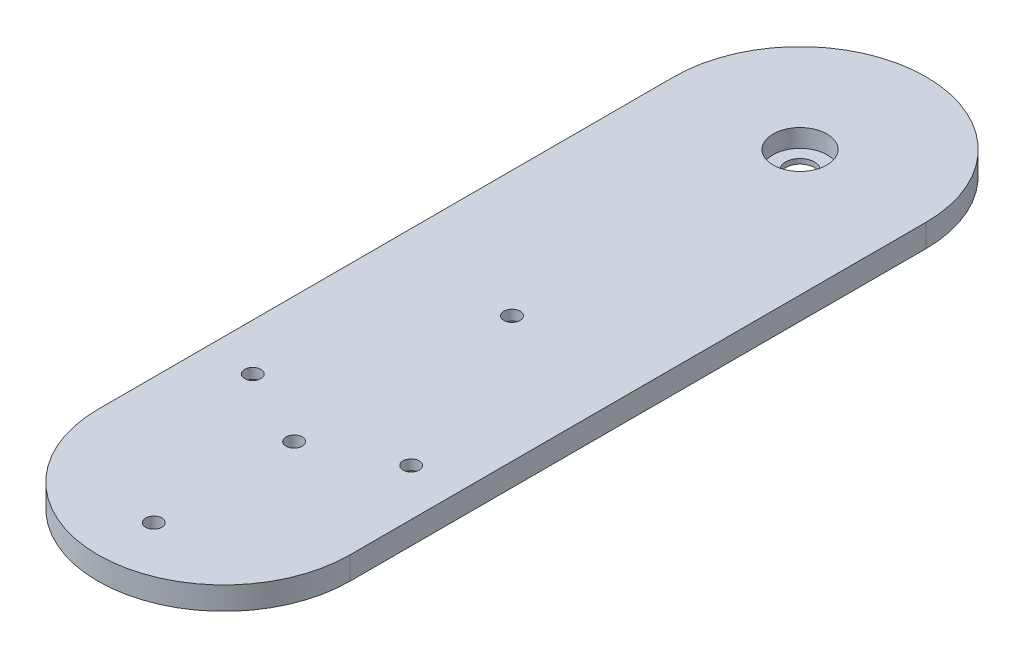
ISO-10303-21;
HEADER;
FILE_DESCRIPTION(('STEP AP214'),'2;1');
FILE_NAME('part.step','',(''),(''),'','','');
FILE_SCHEMA(('AUTOMOTIVE_DESIGN { 1 0 10303 214 1 1 1 1 }'));
ENDSEC;
DATA;
#1=APPLICATION_CONTEXT('core data for automotive mechanical design processes');
#2=APPLICATION_PROTOCOL_DEFINITION('international standard','automotive_design',2000,#1);
#3=PRODUCT_CONTEXT('',#1,'mechanical');
#4=PRODUCT('Part','Part','',(#3));
#5=PRODUCT_RELATED_PRODUCT_CATEGORY('part','',(#4));
#6=PRODUCT_DEFINITION_FORMATION('','',#4);
#7=PRODUCT_DEFINITION_CONTEXT('part definition',#1,'design');
#8=PRODUCT_DEFINITION('design','',#6,#7);
#9=PRODUCT_DEFINITION_SHAPE('','',#8);
#10=(LENGTH_UNIT() NAMED_UNIT(*) SI_UNIT(.MILLI.,.METRE.));
#11=(NAMED_UNIT(*) PLANE_ANGLE_UNIT() SI_UNIT($,.RADIAN.));
#12=(NAMED_UNIT(*) SI_UNIT($,.STERADIAN.) SOLID_ANGLE_UNIT());
#13=UNCERTAINTY_MEASURE_WITH_UNIT(LENGTH_MEASURE(1.E-05),#10,'distance_accuracy_value','');
#14=(GEOMETRIC_REPRESENTATION_CONTEXT(3) GLOBAL_UNCERTAINTY_ASSIGNED_CONTEXT((#13)) GLOBAL_UNIT_ASSIGNED_CONTEXT((#10,
#11,#12)) REPRESENTATION_CONTEXT('',''));
#15=CARTESIAN_POINT('',(0.,0.,0.));
#16=DIRECTION('',(0.,0.,1.));
#17=DIRECTION('',(1.,0.,0.));
#18=AXIS2_PLACEMENT_3D('',#15,#16,#17);
#19=CARTESIAN_POINT('',(22.,-46.75,300.));
#20=DIRECTION('',(0.,-1.,0.));
#21=DIRECTION('',(0.,0.,-1.));
#22=AXIS2_PLACEMENT_3D('',#19,#20,#21);
#23=CYLINDRICAL_SURFACE('',#22,2.25);
#24=CARTESIAN_POINT('',(22.,-46.75,300.));
#25=DIRECTION('',(0.,1.,0.));
#26=DIRECTION('',(0.,0.,1.));
#27=AXIS2_PLACEMENT_3D('',#24,#25,#26);
#28=CIRCLE('',#27,2.25);
#29=CARTESIAN_POINT('',(22.,-46.75,302.25));
#30=VERTEX_POINT('',#29);
#31=EDGE_CURVE('E150',#30,#30,#28,.T.);
#32=ORIENTED_EDGE('',*,*,#31,.T.);
#33=EDGE_LOOP('',(#32));
#34=FACE_BOUND('',#33,.T.);
#35=CARTESIAN_POINT('',(22.,-49.6,300.));
#36=DIRECTION('',(0.,-1.,0.));
#37=DIRECTION('',(0.,0.,-1.));
#38=AXIS2_PLACEMENT_3D('',#35,#36,#37);
#39=CIRCLE('',#38,2.25);
#40=CARTESIAN_POINT('',(22.,-49.6,297.75));
#41=VERTEX_POINT('',#40);
#42=EDGE_CURVE('E43',#41,#41,#39,.T.);
#43=ORIENTED_EDGE('',*,*,#42,.T.);
#44=EDGE_LOOP('',(#43));
#45=FACE_BOUND('',#44,.T.);
#46=ADVANCED_FACE('F39',(#34,#45),#23,.F.);
#47=CARTESIAN_POINT('',(-22.,-46.75,300.));
#48=DIRECTION('',(0.,-1.,0.));
#49=DIRECTION('',(0.,0.,-1.));
#50=AXIS2_PLACEMENT_3D('',#47,#48,#49);
#51=CYLINDRICAL_SURFACE('',#50,2.25);
#52=CARTESIAN_POINT('',(-22.,-46.75,300.));
#53=DIRECTION('',(0.,1.,0.));
#54=DIRECTION('',(0.,0.,1.));
#55=AXIS2_PLACEMENT_3D('',#52,#53,#54);
#56=CIRCLE('',#55,2.25);
#57=CARTESIAN_POINT('',(-22.,-46.75,302.25));
#58=VERTEX_POINT('',#57);
#59=EDGE_CURVE('E152',#58,#58,#56,.T.);
#60=ORIENTED_EDGE('',*,*,#59,.T.);
#61=EDGE_LOOP('',(#60));
#62=FACE_BOUND('',#61,.T.);
#63=CARTESIAN_POINT('',(-22.,-49.6,300.));
#64=DIRECTION('',(0.,-1.,0.));
#65=DIRECTION('',(0.,0.,-1.));
#66=AXIS2_PLACEMENT_3D('',#63,#64,#65);
#67=CIRCLE('',#66,2.25);
#68=CARTESIAN_POINT('',(-22.,-49.6,297.75));
#69=VERTEX_POINT('',#68);
#70=EDGE_CURVE('E117',#69,#69,#67,.T.);
#71=ORIENTED_EDGE('',*,*,#70,.T.);
#72=EDGE_LOOP('',(#71));
#73=FACE_BOUND('',#72,.T.);
#74=ADVANCED_FACE('F172',(#62,#73),#51,.F.);
#75=CARTESIAN_POINT('',(0.,-46.75,250.));
#76=DIRECTION('',(0.,-1.,0.));
#77=DIRECTION('',(0.,0.,-1.));
#78=AXIS2_PLACEMENT_3D('',#75,#76,#77);
#79=CYLINDRICAL_SURFACE('',#78,2.25);
#80=CARTESIAN_POINT('',(0.,-46.75,250.));
#81=DIRECTION('',(0.,1.,0.));
#82=DIRECTION('',(0.,0.,1.));
#83=AXIS2_PLACEMENT_3D('',#80,#81,#82);
#84=CIRCLE('',#83,2.25);
#85=CARTESIAN_POINT('',(0.,-46.75,252.25));
#86=VERTEX_POINT('',#85);
#87=EDGE_CURVE('E106',#86,#86,#84,.T.);
#88=ORIENTED_EDGE('',*,*,#87,.T.);
#89=EDGE_LOOP('',(#88));
#90=FACE_BOUND('',#89,.T.);
#91=CARTESIAN_POINT('',(0.,-49.6,250.));
#92=DIRECTION('',(0.,-1.,0.));
#93=DIRECTION('',(0.,0.,-1.));
#94=AXIS2_PLACEMENT_3D('',#91,#92,#93);
#95=CIRCLE('',#94,2.25);
#96=CARTESIAN_POINT('',(0.,-49.6,247.75));
#97=VERTEX_POINT('',#96);
#98=EDGE_CURVE('E116',#97,#97,#95,.T.);
#99=ORIENTED_EDGE('',*,*,#98,.T.);
#100=EDGE_LOOP('',(#99));
#101=FACE_BOUND('',#100,.T.);
#102=ADVANCED_FACE('F179',(#90,#101),#79,.F.);
#103=CARTESIAN_POINT('',(35.,-46.75,330.));
#104=DIRECTION('',(-1.,0.,0.));
#105=DIRECTION('',(0.,0.,1.));
#106=AXIS2_PLACEMENT_3D('',#103,#104,#105);
#107=PLANE('',#106);
#108=DIRECTION('',(0.,0.,-1.));
#109=VECTOR('',#108,1.);
#110=CARTESIAN_POINT('',(35.,-53.1,330.));
#111=LINE('',#110,#109);
#112=CARTESIAN_POINT('',(35.,-53.1,330.));
#113=VERTEX_POINT('',#112);
#114=CARTESIAN_POINT('',(35.,-53.1,170.));
#115=VERTEX_POINT('',#114);
#116=EDGE_CURVE('E89',#113,#115,#111,.T.);
#117=ORIENTED_EDGE('',*,*,#116,.T.);
#118=DIRECTION('',(0.,-1.,0.));
#119=VECTOR('',#118,1.);
#120=CARTESIAN_POINT('',(35.,-46.75,170.));
#121=LINE('',#120,#119);
#122=CARTESIAN_POINT('',(35.,-46.75,170.));
#123=VERTEX_POINT('',#122);
#124=EDGE_CURVE('E11',#123,#115,#121,.T.);
#125=ORIENTED_EDGE('',*,*,#124,.F.);
#126=DIRECTION('',(0.,0.,-1.));
#127=VECTOR('',#126,1.);
#128=CARTESIAN_POINT('',(35.,-46.75,330.));
#129=LINE('',#128,#127);
#130=CARTESIAN_POINT('',(35.,-46.75,330.));
#131=VERTEX_POINT('',#130);
#132=EDGE_CURVE('E59',#131,#123,#129,.T.);
#133=ORIENTED_EDGE('',*,*,#132,.F.);
#134=DIRECTION('',(0.,-1.,0.));
#135=VECTOR('',#134,1.);
#136=CARTESIAN_POINT('',(35.,-46.75,330.));
#137=LINE('',#136,#135);
#138=EDGE_CURVE('E96',#131,#113,#137,.T.);
#139=ORIENTED_EDGE('',*,*,#138,.T.);
#140=EDGE_LOOP('',(#117,#125,#133,#139));
#141=FACE_BOUND('',#140,.T.);
#142=ADVANCED_FACE('F41',(#141),#107,.F.);
#143=CARTESIAN_POINT('',(-35.,-46.75,330.));
#144=DIRECTION('',(1.,0.,0.));
#145=DIRECTION('',(0.,0.,-1.));
#146=AXIS2_PLACEMENT_3D('',#143,#144,#145);
#147=PLANE('',#146);
#148=DIRECTION('',(0.,0.,1.));
#149=VECTOR('',#148,1.);
#150=CARTESIAN_POINT('',(-35.,-53.1,330.));
#151=LINE('',#150,#149);
#152=CARTESIAN_POINT('',(-35.,-53.1,170.));
#153=VERTEX_POINT('',#152);
#154=CARTESIAN_POINT('',(-35.,-53.1,330.));
#155=VERTEX_POINT('',#154);
#156=EDGE_CURVE('E81',#153,#155,#151,.T.);
#157=ORIENTED_EDGE('',*,*,#156,.T.);
#158=DIRECTION('',(0.,-1.,0.));
#159=VECTOR('',#158,1.);
#160=CARTESIAN_POINT('',(-35.,-46.75,330.));
#161=LINE('',#160,#159);
#162=CARTESIAN_POINT('',(-35.,-46.75,330.));
#163=VERTEX_POINT('',#162);
#164=EDGE_CURVE('E86',#163,#155,#161,.T.);
#165=ORIENTED_EDGE('',*,*,#164,.F.);
#166=DIRECTION('',(0.,0.,1.));
#167=VECTOR('',#166,1.);
#168=CARTESIAN_POINT('',(-35.,-46.75,330.));
#169=LINE('',#168,#167);
#170=CARTESIAN_POINT('',(-35.,-46.75,170.));
#171=VERTEX_POINT('',#170);
#172=EDGE_CURVE('E111',#171,#163,#169,.T.);
#173=ORIENTED_EDGE('',*,*,#172,.F.);
#174=DIRECTION('',(0.,-1.,0.));
#175=VECTOR('',#174,1.);
#176=CARTESIAN_POINT('',(-35.,-46.75,170.));
#177=LINE('',#176,#175);
#178=EDGE_CURVE('E47',#171,#153,#177,.T.);
#179=ORIENTED_EDGE('',*,*,#178,.T.);
#180=EDGE_LOOP('',(#157,#165,#173,#179));
#181=FACE_BOUND('',#180,.T.);
#182=ADVANCED_FACE('F83',(#181),#147,.F.);
#183=CARTESIAN_POINT('',(0.,-46.75,0.));
#184=DIRECTION('',(0.,-1.,0.));
#185=DIRECTION('',(0.,0.,-1.));
#186=AXIS2_PLACEMENT_3D('',#183,#184,#185);
#187=PLANE('',#186);
#188=CARTESIAN_POINT('',(0.,-46.75,310.5));
#189=DIRECTION('',(0.,1.,0.));
#190=DIRECTION('',(0.,0.,1.));
#191=AXIS2_PLACEMENT_3D('',#188,#189,#190);
#192=CIRCLE('',#191,2.25);
#193=CARTESIAN_POINT('',(0.,-46.75,312.75));
#194=VERTEX_POINT('',#193);
#195=EDGE_CURVE('E144',#194,#194,#192,.T.);
#196=ORIENTED_EDGE('',*,*,#195,.F.);
#197=EDGE_LOOP('',(#196));
#198=FACE_BOUND('',#197,.T.);
#199=CARTESIAN_POINT('',(0.,-46.75,349.5));
#200=DIRECTION('',(0.,1.,0.));
#201=DIRECTION('',(0.,0.,1.));
#202=AXIS2_PLACEMENT_3D('',#199,#200,#201);
#203=CIRCLE('',#202,2.25);
#204=CARTESIAN_POINT('',(0.,-46.75,351.75));
#205=VERTEX_POINT('',#204);
#206=EDGE_CURVE('E121',#205,#205,#203,.T.);
#207=ORIENTED_EDGE('',*,*,#206,.F.);
#208=EDGE_LOOP('',(#207));
#209=FACE_BOUND('',#208,.T.);
#210=CARTESIAN_POINT('',(0.,-46.75,170.));
#211=DIRECTION('',(0.,1.,0.));
#212=DIRECTION('',(0.,0.,1.));
#213=AXIS2_PLACEMENT_3D('',#210,#211,#212);
#214=CIRCLE('',#213,7.475);
#215=CARTESIAN_POINT('',(0.,-46.75,177.475));
#216=VERTEX_POINT('',#215);
#217=EDGE_CURVE('E143',#216,#216,#214,.T.);
#218=ORIENTED_EDGE('',*,*,#217,.F.);
#219=EDGE_LOOP('',(#218));
#220=FACE_BOUND('',#219,.T.);
#221=ORIENTED_EDGE('',*,*,#87,.F.);
#222=EDGE_LOOP('',(#221));
#223=FACE_BOUND('',#222,.T.);
#224=ORIENTED_EDGE('',*,*,#59,.F.);
#225=EDGE_LOOP('',(#224));
#226=FACE_BOUND('',#225,.T.);
#227=ORIENTED_EDGE('',*,*,#31,.F.);
#228=EDGE_LOOP('',(#227));
#229=FACE_BOUND('',#228,.T.);
#230=ORIENTED_EDGE('',*,*,#132,.T.);
#231=CARTESIAN_POINT('',(0.,-46.75,170.));
#232=DIRECTION('',(0.,1.,0.));
#233=DIRECTION('',(0.,0.,1.));
#234=AXIS2_PLACEMENT_3D('',#231,#232,#233);
#235=CIRCLE('',#234,35.);
#236=EDGE_CURVE('E104',#123,#171,#235,.T.);
#237=ORIENTED_EDGE('',*,*,#236,.T.);
#238=ORIENTED_EDGE('',*,*,#172,.T.);
#239=CARTESIAN_POINT('',(0.,-46.75,330.));
#240=DIRECTION('',(0.,1.,0.));
#241=DIRECTION('',(0.,0.,1.));
#242=AXIS2_PLACEMENT_3D('',#239,#240,#241);
#243=CIRCLE('',#242,35.);
#244=EDGE_CURVE('E97',#163,#131,#243,.T.);
#245=ORIENTED_EDGE('',*,*,#244,.T.);
#246=EDGE_LOOP('',(#230,#237,#238,#245));
#247=FACE_BOUND('',#246,.T.);
#248=ADVANCED_FACE('F158',(#198,#209,#220,#223,#226,#229,#247),#187,.F.);
#249=CARTESIAN_POINT('',(0.,-53.1,0.));
#250=DIRECTION('',(0.,-1.,0.));
#251=DIRECTION('',(0.,0.,-1.));
#252=AXIS2_PLACEMENT_3D('',#249,#250,#251);
#253=PLANE('',#252);
#254=CARTESIAN_POINT('',(0.,-53.1,250.));
#255=DIRECTION('',(0.,-1.,0.));
#256=DIRECTION('',(0.,0.,-1.));
#257=AXIS2_PLACEMENT_3D('',#254,#255,#256);
#258=CIRCLE('',#257,4.);
#259=CARTESIAN_POINT('',(0.,-53.1,246.));
#260=VERTEX_POINT('',#259);
#261=EDGE_CURVE('E230',#260,#260,#258,.T.);
#262=ORIENTED_EDGE('',*,*,#261,.F.);
#263=EDGE_LOOP('',(#262));
#264=FACE_BOUND('',#263,.T.);
#265=CARTESIAN_POINT('',(22.,-53.1,300.));
#266=DIRECTION('',(0.,-1.,0.));
#267=DIRECTION('',(0.,0.,-1.));
#268=AXIS2_PLACEMENT_3D('',#265,#266,#267);
#269=CIRCLE('',#268,4.);
#270=CARTESIAN_POINT('',(22.,-53.1,296.));
#271=VERTEX_POINT('',#270);
#272=EDGE_CURVE('E235',#271,#271,#269,.T.);
#273=ORIENTED_EDGE('',*,*,#272,.F.);
#274=EDGE_LOOP('',(#273));
#275=FACE_BOUND('',#274,.T.);
#276=CARTESIAN_POINT('',(-22.,-53.1,300.));
#277=DIRECTION('',(0.,-1.,0.));
#278=DIRECTION('',(0.,0.,-1.));
#279=AXIS2_PLACEMENT_3D('',#276,#277,#278);
#280=CIRCLE('',#279,4.);
#281=CARTESIAN_POINT('',(-22.,-53.1,296.));
#282=VERTEX_POINT('',#281);
#283=EDGE_CURVE('E239',#282,#282,#280,.T.);
#284=ORIENTED_EDGE('',*,*,#283,.F.);
#285=EDGE_LOOP('',(#284));
#286=FACE_BOUND('',#285,.T.);
#287=CARTESIAN_POINT('',(0.,-53.1,310.5));
#288=DIRECTION('',(0.,1.,0.));
#289=DIRECTION('',(0.,0.,1.));
#290=AXIS2_PLACEMENT_3D('',#287,#288,#289);
#291=CIRCLE('',#290,2.25);
#292=CARTESIAN_POINT('',(0.,-53.1,312.75));
#293=VERTEX_POINT('',#292);
#294=EDGE_CURVE('E132',#293,#293,#291,.T.);
#295=ORIENTED_EDGE('',*,*,#294,.T.);
#296=EDGE_LOOP('',(#295));
#297=FACE_BOUND('',#296,.T.);
#298=CARTESIAN_POINT('',(0.,-53.1,349.5));
#299=DIRECTION('',(0.,1.,0.));
#300=DIRECTION('',(0.,0.,1.));
#301=AXIS2_PLACEMENT_3D('',#298,#299,#300);
#302=CIRCLE('',#301,2.25);
#303=CARTESIAN_POINT('',(0.,-53.1,351.75));
#304=VERTEX_POINT('',#303);
#305=EDGE_CURVE('E130',#304,#304,#302,.T.);
#306=ORIENTED_EDGE('',*,*,#305,.T.);
#307=EDGE_LOOP('',(#306));
#308=FACE_BOUND('',#307,.T.);
#309=CARTESIAN_POINT('',(0.,-53.1,170.));
#310=DIRECTION('',(0.,1.,0.));
#311=DIRECTION('',(0.,0.,1.));
#312=AXIS2_PLACEMENT_3D('',#309,#310,#311);
#313=CIRCLE('',#312,4.);
#314=CARTESIAN_POINT('',(0.,-53.1,166.));
#315=VERTEX_POINT('',#314);
#316=EDGE_CURVE('E142',#315,#315,#313,.T.);
#317=ORIENTED_EDGE('',*,*,#316,.T.);
#318=EDGE_LOOP('',(#317));
#319=FACE_BOUND('',#318,.T.);
#320=ORIENTED_EDGE('',*,*,#156,.F.);
#321=CARTESIAN_POINT('',(0.,-53.1,170.));
#322=DIRECTION('',(0.,1.,0.));
#323=DIRECTION('',(0.,0.,1.));
#324=AXIS2_PLACEMENT_3D('',#321,#322,#323);
#325=CIRCLE('',#324,35.);
#326=EDGE_CURVE('E68',#115,#153,#325,.T.);
#327=ORIENTED_EDGE('',*,*,#326,.F.);
#328=ORIENTED_EDGE('',*,*,#116,.F.);
#329=CARTESIAN_POINT('',(0.,-53.1,330.));
#330=DIRECTION('',(0.,1.,0.));
#331=DIRECTION('',(0.,0.,1.));
#332=AXIS2_PLACEMENT_3D('',#329,#330,#331);
#333=CIRCLE('',#332,35.);
#334=EDGE_CURVE('E95',#155,#113,#333,.T.);
#335=ORIENTED_EDGE('',*,*,#334,.F.);
#336=EDGE_LOOP('',(#320,#327,#328,#335));
#337=FACE_BOUND('',#336,.T.);
#338=ADVANCED_FACE('F103',(#264,#275,#286,#297,#308,#319,#337),#253,.T.);
#339=CARTESIAN_POINT('',(0.,-46.75,330.));
#340=DIRECTION('',(0.,-1.,0.));
#341=DIRECTION('',(0.,0.,-1.));
#342=AXIS2_PLACEMENT_3D('',#339,#340,#341);
#343=CYLINDRICAL_SURFACE('',#342,35.);
#344=ORIENTED_EDGE('',*,*,#334,.T.);
#345=ORIENTED_EDGE('',*,*,#138,.F.);
#346=ORIENTED_EDGE('',*,*,#244,.F.);
#347=ORIENTED_EDGE('',*,*,#164,.T.);
#348=EDGE_LOOP('',(#344,#345,#346,#347));
#349=FACE_BOUND('',#348,.T.);
#350=ADVANCED_FACE('F93',(#349),#343,.T.);
#351=CARTESIAN_POINT('',(0.,-46.75,170.));
#352=DIRECTION('',(0.,-1.,0.));
#353=DIRECTION('',(0.,0.,-1.));
#354=AXIS2_PLACEMENT_3D('',#351,#352,#353);
#355=CYLINDRICAL_SURFACE('',#354,35.);
#356=ORIENTED_EDGE('',*,*,#236,.F.);
#357=ORIENTED_EDGE('',*,*,#124,.T.);
#358=ORIENTED_EDGE('',*,*,#326,.T.);
#359=ORIENTED_EDGE('',*,*,#178,.F.);
#360=EDGE_LOOP('',(#356,#357,#358,#359));
#361=FACE_BOUND('',#360,.T.);
#362=ADVANCED_FACE('F160',(#361),#355,.T.);
#363=CARTESIAN_POINT('',(0.,-46.75,170.));
#364=DIRECTION('',(0.,-1.,0.));
#365=DIRECTION('',(0.,0.,-1.));
#366=AXIS2_PLACEMENT_3D('',#363,#364,#365);
#367=CYLINDRICAL_SURFACE('',#366,7.475);
#368=ORIENTED_EDGE('',*,*,#217,.T.);
#369=EDGE_LOOP('',(#368));
#370=FACE_BOUND('',#369,.T.);
#371=CARTESIAN_POINT('',(0.,-51.75,170.));
#372=DIRECTION('',(0.,1.,0.));
#373=DIRECTION('',(0.,0.,1.));
#374=AXIS2_PLACEMENT_3D('',#371,#372,#373);
#375=CIRCLE('',#374,7.475);
#376=CARTESIAN_POINT('',(0.,-51.75,177.475));
#377=VERTEX_POINT('',#376);
#378=EDGE_CURVE('E140',#377,#377,#375,.T.);
#379=ORIENTED_EDGE('',*,*,#378,.F.);
#380=EDGE_LOOP('',(#379));
#381=FACE_BOUND('',#380,.T.);
#382=ADVANCED_FACE('F162',(#370,#381),#367,.F.);
#383=CARTESIAN_POINT('',(0.,-51.75,170.));
#384=DIRECTION('',(0.,1.,0.));
#385=DIRECTION('',(0.,0.,1.));
#386=AXIS2_PLACEMENT_3D('',#383,#384,#385);
#387=PLANE('',#386);
#388=CARTESIAN_POINT('',(0.,-51.75,170.));
#389=DIRECTION('',(0.,1.,0.));
#390=DIRECTION('',(0.,0.,1.));
#391=AXIS2_PLACEMENT_3D('',#388,#389,#390);
#392=CIRCLE('',#391,4.);
#393=CARTESIAN_POINT('',(0.,-51.75,166.));
#394=VERTEX_POINT('',#393);
#395=EDGE_CURVE('E137',#394,#394,#392,.T.);
#396=ORIENTED_EDGE('',*,*,#395,.F.);
#397=EDGE_LOOP('',(#396));
#398=FACE_BOUND('',#397,.T.);
#399=ORIENTED_EDGE('',*,*,#378,.T.);
#400=EDGE_LOOP('',(#399));
#401=FACE_BOUND('',#400,.T.);
#402=ADVANCED_FACE('F166',(#398,#401),#387,.T.);
#403=CARTESIAN_POINT('',(0.,-51.75,170.));
#404=DIRECTION('',(0.,-1.,0.));
#405=DIRECTION('',(0.,0.,-1.));
#406=AXIS2_PLACEMENT_3D('',#403,#404,#405);
#407=CYLINDRICAL_SURFACE('',#406,4.);
#408=CARTESIAN_POINT('',(0.,-51.75,166.));
#409=CARTESIAN_POINT('',(0.,-51.7640625,166.));
#410=CARTESIAN_POINT('',(0.,-51.778125,166.));
#411=CARTESIAN_POINT('',(0.,-51.80625,166.));
#412=CARTESIAN_POINT('',(0.,-51.8203125,166.));
#413=CARTESIAN_POINT('',(0.,-51.8484375,166.));
#414=CARTESIAN_POINT('',(0.,-51.8625,166.));
#415=CARTESIAN_POINT('',(0.,-51.890625,166.));
#416=CARTESIAN_POINT('',(0.,-51.9046875,166.));
#417=CARTESIAN_POINT('',(0.,-51.9328125,166.));
#418=CARTESIAN_POINT('',(0.,-51.946875,166.));
#419=CARTESIAN_POINT('',(0.,-51.975,166.));
#420=CARTESIAN_POINT('',(0.,-51.9890625,166.));
#421=CARTESIAN_POINT('',(0.,-52.0171875,166.));
#422=CARTESIAN_POINT('',(0.,-52.03125,166.));
#423=CARTESIAN_POINT('',(0.,-52.059375,166.));
#424=CARTESIAN_POINT('',(0.,-52.0734375,166.));
#425=CARTESIAN_POINT('',(0.,-52.1015625,166.));
#426=CARTESIAN_POINT('',(0.,-52.115625,166.));
#427=CARTESIAN_POINT('',(0.,-52.14375,166.));
#428=CARTESIAN_POINT('',(0.,-52.1578125,166.));
#429=CARTESIAN_POINT('',(0.,-52.1859375,166.));
#430=CARTESIAN_POINT('',(0.,-52.2,166.));
#431=CARTESIAN_POINT('',(0.,-52.228125,166.));
#432=CARTESIAN_POINT('',(0.,-52.2421875,166.));
#433=CARTESIAN_POINT('',(0.,-52.2703125,166.));
#434=CARTESIAN_POINT('',(0.,-52.284375,166.));
#435=CARTESIAN_POINT('',(0.,-52.3125,166.));
#436=CARTESIAN_POINT('',(0.,-52.3265625,166.));
#437=CARTESIAN_POINT('',(0.,-52.3546875,166.));
#438=CARTESIAN_POINT('',(0.,-52.36875,166.));
#439=CARTESIAN_POINT('',(0.,-52.396875,166.));
#440=CARTESIAN_POINT('',(0.,-52.4109375,166.));
#441=CARTESIAN_POINT('',(0.,-52.4390625,166.));
#442=CARTESIAN_POINT('',(0.,-52.453125,166.));
#443=CARTESIAN_POINT('',(0.,-52.48125,166.));
#444=CARTESIAN_POINT('',(0.,-52.4953125,166.));
#445=CARTESIAN_POINT('',(0.,-52.5234375,166.));
#446=CARTESIAN_POINT('',(0.,-52.5375,166.));
#447=CARTESIAN_POINT('',(0.,-52.565625,166.));
#448=CARTESIAN_POINT('',(0.,-52.5796875,166.));
#449=CARTESIAN_POINT('',(0.,-52.6078125,166.));
#450=CARTESIAN_POINT('',(0.,-52.621875,166.));
#451=CARTESIAN_POINT('',(0.,-52.65,166.));
#452=CARTESIAN_POINT('',(0.,-52.6640625,166.));
#453=CARTESIAN_POINT('',(0.,-52.6921875,166.));
#454=CARTESIAN_POINT('',(0.,-52.70625,166.));
#455=CARTESIAN_POINT('',(0.,-52.734375,166.));
#456=CARTESIAN_POINT('',(0.,-52.7484375,166.));
#457=CARTESIAN_POINT('',(0.,-52.7765625,166.));
#458=CARTESIAN_POINT('',(0.,-52.790625,166.));
#459=CARTESIAN_POINT('',(0.,-52.81875,166.));
#460=CARTESIAN_POINT('',(0.,-52.8328125,166.));
#461=CARTESIAN_POINT('',(0.,-52.8609375,166.));
#462=CARTESIAN_POINT('',(0.,-52.875,166.));
#463=CARTESIAN_POINT('',(0.,-52.903125,166.));
#464=CARTESIAN_POINT('',(0.,-52.9171875,166.));
#465=CARTESIAN_POINT('',(0.,-52.9453125,166.));
#466=CARTESIAN_POINT('',(0.,-52.959375,166.));
#467=CARTESIAN_POINT('',(0.,-52.9875,166.));
#468=CARTESIAN_POINT('',(0.,-53.0015625,166.));
#469=CARTESIAN_POINT('',(0.,-53.0296875,166.));
#470=CARTESIAN_POINT('',(0.,-53.04375,166.));
#471=CARTESIAN_POINT('',(0.,-53.071875,166.));
#472=CARTESIAN_POINT('',(0.,-53.0859375,166.));
#473=CARTESIAN_POINT('',(0.,-53.1,166.));
#474=B_SPLINE_CURVE_WITH_KNOTS('',3,(#408,#409,#410,#411,#412,#413,#414,#415,#416,#417,#418,
#419,#420,#421,#422,#423,#424,#425,#426,#427,#428,#429,#430,#431,#432,#433,#434,#435,#436,#437,
#438,#439,#440,#441,#442,#443,#444,#445,#446,#447,#448,#449,#450,#451,#452,#453,#454,#455,#456,
#457,#458,#459,#460,#461,#462,#463,#464,#465,#466,#467,#468,#469,#470,#471,#472,#473),
.UNSPECIFIED.,.F.,.F.,(4,2,2,2,2,2,2,2,2,2,2,2,2,2,2,2,2,2,2,2,2,2,2,2,2,2,2,2,2,2,2,2,4),(0.,
0.0421874999999988,0.0843749999999976,0.126562499999996,0.168749999999995,0.210937499999994,
0.253124999999993,0.295312499999999,0.337499999999998,0.379687499999996,0.421874999999995,
0.464062499999994,0.506249999999993,0.548437499999999,0.590624999999997,0.632812499999996,
0.674999999999995,0.717187499999994,0.759374999999993,0.801562499999992,0.843749999999997,
0.885937499999996,0.928124999999995,0.970312499999994,1.01249999999999,1.05468749999999,
1.096875,1.1390625,1.18124999999999,1.22343749999999,1.26562499999999,1.30781249999999,
1.34999999999999),.UNSPECIFIED.);
#475=EDGE_CURVE('BSEAM186',#394,#315,#474,.T.);
#476=ORIENTED_EDGE('',*,*,#395,.T.);
#477=ORIENTED_EDGE('',*,*,#316,.F.);
#478=ORIENTED_EDGE('',*,*,#475,.T.);
#479=ORIENTED_EDGE('',*,*,#475,.F.);
#480=EDGE_LOOP('',(#476,#478,#477,#479));
#481=FACE_BOUND('',#480,.T.);
#482=ADVANCED_FACE('F186',(#481),#407,.F.);
#483=CARTESIAN_POINT('',(0.,-46.75,349.5));
#484=DIRECTION('',(0.,-1.,0.));
#485=DIRECTION('',(0.,0.,-1.));
#486=AXIS2_PLACEMENT_3D('',#483,#484,#485);
#487=CYLINDRICAL_SURFACE('',#486,2.25);
#488=ORIENTED_EDGE('',*,*,#206,.T.);
#489=EDGE_LOOP('',(#488));
#490=FACE_BOUND('',#489,.T.);
#491=ORIENTED_EDGE('',*,*,#305,.F.);
#492=EDGE_LOOP('',(#491));
#493=FACE_BOUND('',#492,.T.);
#494=ADVANCED_FACE('F195',(#490,#493),#487,.F.);
#495=CARTESIAN_POINT('',(0.,-46.75,310.5));
#496=DIRECTION('',(0.,-1.,0.));
#497=DIRECTION('',(0.,0.,-1.));
#498=AXIS2_PLACEMENT_3D('',#495,#496,#497);
#499=CYLINDRICAL_SURFACE('',#498,2.25);
#500=ORIENTED_EDGE('',*,*,#195,.T.);
#501=EDGE_LOOP('',(#500));
#502=FACE_BOUND('',#501,.T.);
#503=ORIENTED_EDGE('',*,*,#294,.F.);
#504=EDGE_LOOP('',(#503));
#505=FACE_BOUND('',#504,.T.);
#506=ADVANCED_FACE('F200',(#502,#505),#499,.F.);
#507=CARTESIAN_POINT('',(0.,-49.6,250.));
#508=DIRECTION('',(0.,-1.,0.));
#509=DIRECTION('',(0.,0.,-1.));
#510=AXIS2_PLACEMENT_3D('',#507,#508,#509);
#511=CYLINDRICAL_SURFACE('',#510,4.);
#512=CARTESIAN_POINT('',(0.,-49.6,250.));
#513=DIRECTION('',(0.,-1.,0.));
#514=DIRECTION('',(0.,0.,-1.));
#515=AXIS2_PLACEMENT_3D('',#512,#513,#514);
#516=CIRCLE('',#515,4.);
#517=CARTESIAN_POINT('',(0.,-49.6,246.));
#518=VERTEX_POINT('',#517);
#519=EDGE_CURVE('E118',#518,#518,#516,.T.);
#520=ORIENTED_EDGE('',*,*,#519,.F.);
#521=EDGE_LOOP('',(#520));
#522=FACE_BOUND('',#521,.T.);
#523=ORIENTED_EDGE('',*,*,#261,.T.);
#524=EDGE_LOOP('',(#523));
#525=FACE_BOUND('',#524,.T.);
#526=ADVANCED_FACE('F198',(#522,#525),#511,.F.);
#527=CARTESIAN_POINT('',(0.,-49.6,250.));
#528=DIRECTION('',(0.,-1.,0.));
#529=DIRECTION('',(0.,0.,-1.));
#530=AXIS2_PLACEMENT_3D('',#527,#528,#529);
#531=PLANE('',#530);
#532=ORIENTED_EDGE('',*,*,#98,.F.);
#533=EDGE_LOOP('',(#532));
#534=FACE_BOUND('',#533,.T.);
#535=ORIENTED_EDGE('',*,*,#519,.T.);
#536=EDGE_LOOP('',(#535));
#537=FACE_BOUND('',#536,.T.);
#538=ADVANCED_FACE('F209',(#534,#537),#531,.T.);
#539=CARTESIAN_POINT('',(-22.,-49.6,300.));
#540=DIRECTION('',(0.,-1.,0.));
#541=DIRECTION('',(0.,0.,-1.));
#542=AXIS2_PLACEMENT_3D('',#539,#540,#541);
#543=CYLINDRICAL_SURFACE('',#542,4.);
#544=CARTESIAN_POINT('',(-22.,-49.6,300.));
#545=DIRECTION('',(0.,-1.,0.));
#546=DIRECTION('',(0.,0.,-1.));
#547=AXIS2_PLACEMENT_3D('',#544,#545,#546);
#548=CIRCLE('',#547,4.);
#549=CARTESIAN_POINT('',(-22.,-49.6,296.));
#550=VERTEX_POINT('',#549);
#551=EDGE_CURVE('E243',#550,#550,#548,.T.);
#552=ORIENTED_EDGE('',*,*,#551,.F.);
#553=EDGE_LOOP('',(#552));
#554=FACE_BOUND('',#553,.T.);
#555=ORIENTED_EDGE('',*,*,#283,.T.);
#556=EDGE_LOOP('',(#555));
#557=FACE_BOUND('',#556,.T.);
#558=ADVANCED_FACE('F205',(#554,#557),#543,.F.);
#559=CARTESIAN_POINT('',(-22.,-49.6,300.));
#560=DIRECTION('',(0.,-1.,0.));
#561=DIRECTION('',(0.,0.,-1.));
#562=AXIS2_PLACEMENT_3D('',#559,#560,#561);
#563=PLANE('',#562);
#564=ORIENTED_EDGE('',*,*,#70,.F.);
#565=EDGE_LOOP('',(#564));
#566=FACE_BOUND('',#565,.T.);
#567=ORIENTED_EDGE('',*,*,#551,.T.);
#568=EDGE_LOOP('',(#567));
#569=FACE_BOUND('',#568,.T.);
#570=ADVANCED_FACE('F201',(#566,#569),#563,.T.);
#571=CARTESIAN_POINT('',(22.,-49.6,300.));
#572=DIRECTION('',(0.,-1.,0.));
#573=DIRECTION('',(0.,0.,-1.));
#574=AXIS2_PLACEMENT_3D('',#571,#572,#573);
#575=CYLINDRICAL_SURFACE('',#574,4.);
#576=CARTESIAN_POINT('',(22.,-49.6,300.));
#577=DIRECTION('',(0.,-1.,0.));
#578=DIRECTION('',(0.,0.,-1.));
#579=AXIS2_PLACEMENT_3D('',#576,#577,#578);
#580=CIRCLE('',#579,4.);
#581=CARTESIAN_POINT('',(22.,-49.6,296.));
#582=VERTEX_POINT('',#581);
#583=EDGE_CURVE('E240',#582,#582,#580,.T.);
#584=ORIENTED_EDGE('',*,*,#583,.F.);
#585=EDGE_LOOP('',(#584));
#586=FACE_BOUND('',#585,.T.);
#587=ORIENTED_EDGE('',*,*,#272,.T.);
#588=EDGE_LOOP('',(#587));
#589=FACE_BOUND('',#588,.T.);
#590=ADVANCED_FACE('F203',(#586,#589),#575,.F.);
#591=CARTESIAN_POINT('',(22.,-49.6,300.));
#592=DIRECTION('',(0.,-1.,0.));
#593=DIRECTION('',(0.,0.,-1.));
#594=AXIS2_PLACEMENT_3D('',#591,#592,#593);
#595=PLANE('',#594);
#596=ORIENTED_EDGE('',*,*,#42,.F.);
#597=EDGE_LOOP('',(#596));
#598=FACE_BOUND('',#597,.T.);
#599=ORIENTED_EDGE('',*,*,#583,.T.);
#600=EDGE_LOOP('',(#599));
#601=FACE_BOUND('',#600,.T.);
#602=ADVANCED_FACE('F214',(#598,#601),#595,.T.);
#603=CLOSED_SHELL('',(#46,#74,#102,#142,#182,#248,#338,#350,#362,#382,#402,#482,#494,#506,#526,
#538,#558,#570,#590,#602));
#604=MANIFOLD_SOLID_BREP('B2',#603);
#605=ADVANCED_BREP_SHAPE_REPRESENTATION('',(#18,#604),#14);
#606=SHAPE_DEFINITION_REPRESENTATION(#9,#605);
ENDSEC;
END-ISO-10303-21;
